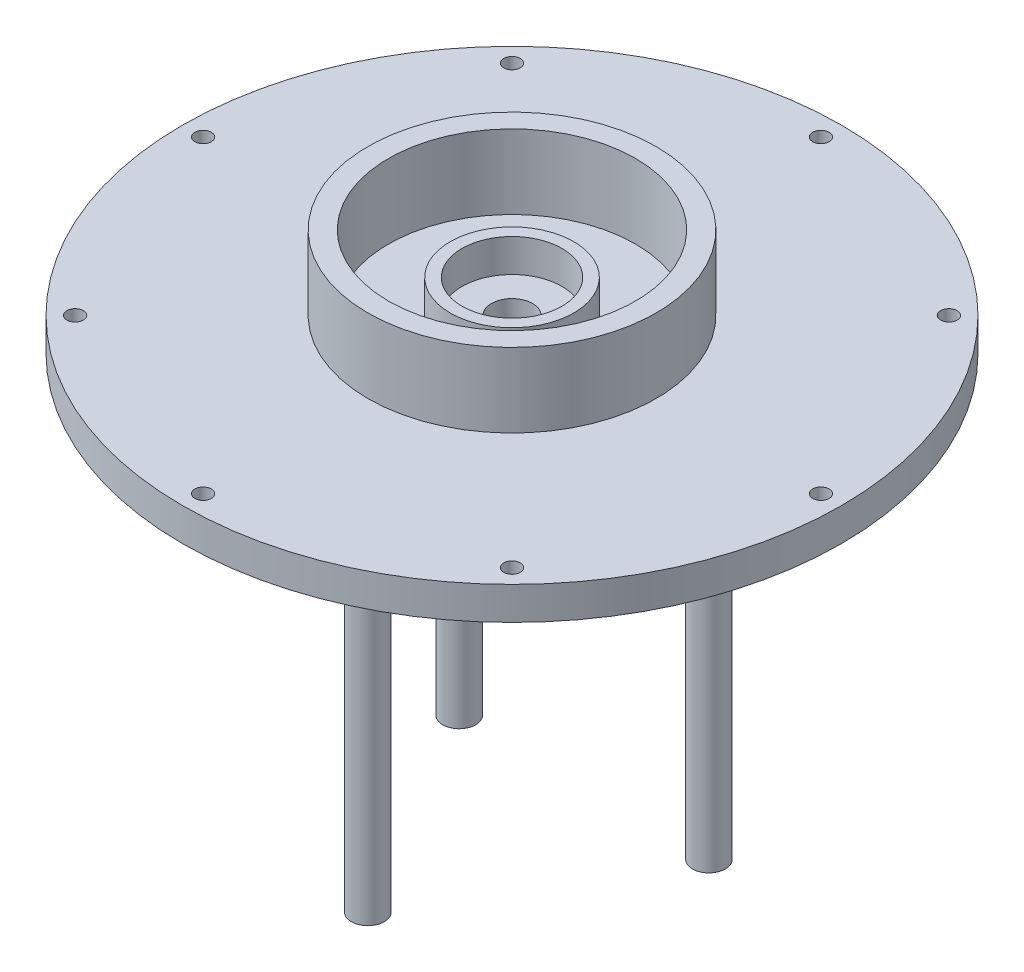
ISO-10303-21;
HEADER;
FILE_DESCRIPTION(('STEP AP214'),'2;1');
FILE_NAME('part.step','',(''),(''),'','','');
FILE_SCHEMA(('AUTOMOTIVE_DESIGN { 1 0 10303 214 1 1 1 1 }'));
ENDSEC;
DATA;
#1=APPLICATION_CONTEXT('core data for automotive mechanical design processes');
#2=APPLICATION_PROTOCOL_DEFINITION('international standard','automotive_design',2000,#1);
#3=PRODUCT_CONTEXT('',#1,'mechanical');
#4=PRODUCT('Part','Part','',(#3));
#5=PRODUCT_RELATED_PRODUCT_CATEGORY('part','',(#4));
#6=PRODUCT_DEFINITION_FORMATION('','',#4);
#7=PRODUCT_DEFINITION_CONTEXT('part definition',#1,'design');
#8=PRODUCT_DEFINITION('design','',#6,#7);
#9=PRODUCT_DEFINITION_SHAPE('','',#8);
#10=(LENGTH_UNIT() NAMED_UNIT(*) SI_UNIT(.MILLI.,.METRE.));
#11=(NAMED_UNIT(*) PLANE_ANGLE_UNIT() SI_UNIT($,.RADIAN.));
#12=(NAMED_UNIT(*) SI_UNIT($,.STERADIAN.) SOLID_ANGLE_UNIT());
#13=UNCERTAINTY_MEASURE_WITH_UNIT(LENGTH_MEASURE(1.E-05),#10,'distance_accuracy_value','');
#14=(GEOMETRIC_REPRESENTATION_CONTEXT(3) GLOBAL_UNCERTAINTY_ASSIGNED_CONTEXT((#13)) GLOBAL_UNIT_ASSIGNED_CONTEXT((#10,
#11,#12)) REPRESENTATION_CONTEXT('',''));
#15=CARTESIAN_POINT('',(0.,0.,0.));
#16=DIRECTION('',(0.,0.,1.));
#17=DIRECTION('',(1.,0.,0.));
#18=AXIS2_PLACEMENT_3D('',#15,#16,#17);
#19=CARTESIAN_POINT('',(0.,8.,0.));
#20=DIRECTION('',(0.,1.,0.));
#21=DIRECTION('',(0.,0.,1.));
#22=AXIS2_PLACEMENT_3D('',#19,#20,#21);
#23=PLANE('',#22);
#24=CARTESIAN_POINT('',(0.,8.,0.));
#25=DIRECTION('',(0.,1.,0.));
#26=DIRECTION('',(0.,0.,1.));
#27=AXIS2_PLACEMENT_3D('',#24,#25,#26);
#28=CIRCLE('',#27,15.);
#29=CARTESIAN_POINT('',(0.,8.,15.));
#30=VERTEX_POINT('',#29);
#31=EDGE_CURVE('E176',#30,#30,#28,.T.);
#32=ORIENTED_EDGE('',*,*,#31,.F.);
#33=EDGE_LOOP('',(#32));
#34=FACE_BOUND('',#33,.T.);
#35=CARTESIAN_POINT('',(0.,8.,0.));
#36=DIRECTION('',(0.,1.,0.));
#37=DIRECTION('',(0.,0.,1.));
#38=AXIS2_PLACEMENT_3D('',#35,#36,#37);
#39=CIRCLE('',#38,30.);
#40=CARTESIAN_POINT('',(0.,8.,30.));
#41=VERTEX_POINT('',#40);
#42=EDGE_CURVE('E85',#41,#41,#39,.F.);
#43=ORIENTED_EDGE('',*,*,#42,.F.);
#44=EDGE_LOOP('',(#43));
#45=FACE_BOUND('',#44,.T.);
#46=ADVANCED_FACE('F67',(#34,#45),#23,.T.);
#47=CARTESIAN_POINT('',(0.,8.,0.));
#48=DIRECTION('',(0.,1.,0.));
#49=DIRECTION('',(0.,0.,1.));
#50=AXIS2_PLACEMENT_3D('',#47,#48,#49);
#51=CIRCLE('',#50,5.);
#52=CARTESIAN_POINT('',(0.,8.,5.));
#53=VERTEX_POINT('',#52);
#54=EDGE_CURVE('E134',#53,#53,#51,.T.);
#55=ORIENTED_EDGE('',*,*,#54,.F.);
#56=EDGE_LOOP('',(#55));
#57=FACE_BOUND('',#56,.T.);
#58=CARTESIAN_POINT('',(0.,8.,0.));
#59=DIRECTION('',(0.,1.,0.));
#60=DIRECTION('',(0.,0.,1.));
#61=AXIS2_PLACEMENT_3D('',#58,#59,#60);
#62=CIRCLE('',#61,12.15);
#63=CARTESIAN_POINT('',(0.,8.,12.15));
#64=VERTEX_POINT('',#63);
#65=EDGE_CURVE('E91',#64,#64,#62,.F.);
#66=ORIENTED_EDGE('',*,*,#65,.F.);
#67=EDGE_LOOP('',(#66));
#68=FACE_BOUND('',#67,.T.);
#69=ADVANCED_FACE('F228',(#57,#68),#23,.T.);
#70=CARTESIAN_POINT('',(0.,8.,0.));
#71=DIRECTION('',(0.,1.,0.));
#72=DIRECTION('',(0.,0.,1.));
#73=AXIS2_PLACEMENT_3D('',#70,#71,#72);
#74=CIRCLE('',#73,35.);
#75=CARTESIAN_POINT('',(0.,8.,35.));
#76=VERTEX_POINT('',#75);
#77=EDGE_CURVE('E181',#76,#76,#74,.T.);
#78=ORIENTED_EDGE('',*,*,#77,.F.);
#79=EDGE_LOOP('',(#78));
#80=FACE_BOUND('',#79,.T.);
#81=CARTESIAN_POINT('',(0.,8.,-75.));
#82=DIRECTION('',(0.,1.,0.));
#83=DIRECTION('',(0.,0.,1.));
#84=AXIS2_PLACEMENT_3D('',#81,#82,#83);
#85=CIRCLE('',#84,2.);
#86=CARTESIAN_POINT('',(0.,8.,-73.));
#87=VERTEX_POINT('',#86);
#88=EDGE_CURVE('E129',#87,#87,#85,.T.);
#89=ORIENTED_EDGE('',*,*,#88,.F.);
#90=EDGE_LOOP('',(#89));
#91=FACE_BOUND('',#90,.T.);
#92=CARTESIAN_POINT('',(53.0330085889912,8.,-53.033008588991));
#93=DIRECTION('',(0.,1.,0.));
#94=DIRECTION('',(0.,0.,1.));
#95=AXIS2_PLACEMENT_3D('',#92,#93,#94);
#96=CIRCLE('',#95,2.);
#97=CARTESIAN_POINT('',(53.0330085889912,8.,-51.033008588991));
#98=VERTEX_POINT('',#97);
#99=EDGE_CURVE('E169',#98,#98,#96,.T.);
#100=ORIENTED_EDGE('',*,*,#99,.F.);
#101=EDGE_LOOP('',(#100));
#102=FACE_BOUND('',#101,.T.);
#103=CARTESIAN_POINT('',(75.,8.,2.61861100413235E-13));
#104=DIRECTION('',(0.,1.,0.));
#105=DIRECTION('',(0.,0.,1.));
#106=AXIS2_PLACEMENT_3D('',#103,#104,#105);
#107=CIRCLE('',#106,2.);
#108=CARTESIAN_POINT('',(75.,8.,2.00000000000027));
#109=VERTEX_POINT('',#108);
#110=EDGE_CURVE('E165',#109,#109,#107,.T.);
#111=ORIENTED_EDGE('',*,*,#110,.F.);
#112=EDGE_LOOP('',(#111));
#113=FACE_BOUND('',#112,.T.);
#114=CARTESIAN_POINT('',(53.0330085889908,8.,53.0330085889914));
#115=DIRECTION('',(0.,1.,0.));
#116=DIRECTION('',(0.,0.,1.));
#117=AXIS2_PLACEMENT_3D('',#114,#115,#116);
#118=CIRCLE('',#117,2.);
#119=CARTESIAN_POINT('',(53.0330085889908,8.,55.0330085889914));
#120=VERTEX_POINT('',#119);
#121=EDGE_CURVE('E161',#120,#120,#118,.T.);
#122=ORIENTED_EDGE('',*,*,#121,.F.);
#123=EDGE_LOOP('',(#122));
#124=FACE_BOUND('',#123,.T.);
#125=CARTESIAN_POINT('',(-5.2372220082647E-13,8.,75.));
#126=DIRECTION('',(0.,1.,0.));
#127=DIRECTION('',(0.,0.,1.));
#128=AXIS2_PLACEMENT_3D('',#125,#126,#127);
#129=CIRCLE('',#128,2.);
#130=CARTESIAN_POINT('',(-5.2372220082647E-13,8.,77.));
#131=VERTEX_POINT('',#130);
#132=EDGE_CURVE('E157',#131,#131,#129,.T.);
#133=ORIENTED_EDGE('',*,*,#132,.F.);
#134=EDGE_LOOP('',(#133));
#135=FACE_BOUND('',#134,.T.);
#136=CARTESIAN_POINT('',(-53.0330085889915,8.,53.0330085889906));
#137=DIRECTION('',(0.,1.,0.));
#138=DIRECTION('',(0.,0.,1.));
#139=AXIS2_PLACEMENT_3D('',#136,#137,#138);
#140=CIRCLE('',#139,2.00000000000001);
#141=CARTESIAN_POINT('',(-53.0330085889915,8.,55.0330085889906));
#142=VERTEX_POINT('',#141);
#143=EDGE_CURVE('E153',#142,#142,#140,.T.);
#144=ORIENTED_EDGE('',*,*,#143,.F.);
#145=EDGE_LOOP('',(#144));
#146=FACE_BOUND('',#145,.T.);
#147=CARTESIAN_POINT('',(-75.,8.,-7.85583301239705E-13));
#148=DIRECTION('',(0.,1.,0.));
#149=DIRECTION('',(0.,0.,1.));
#150=AXIS2_PLACEMENT_3D('',#147,#148,#149);
#151=CIRCLE('',#150,2.);
#152=CARTESIAN_POINT('',(-75.,8.,1.99999999999922));
#153=VERTEX_POINT('',#152);
#154=EDGE_CURVE('E148',#153,#153,#151,.T.);
#155=ORIENTED_EDGE('',*,*,#154,.F.);
#156=EDGE_LOOP('',(#155));
#157=FACE_BOUND('',#156,.T.);
#158=CARTESIAN_POINT('',(-53.0330085889904,8.,-53.0330085889917));
#159=DIRECTION('',(0.,1.,0.));
#160=DIRECTION('',(0.,0.,1.));
#161=AXIS2_PLACEMENT_3D('',#158,#159,#160);
#162=CIRCLE('',#161,2.00000000000001);
#163=CARTESIAN_POINT('',(-53.0330085889904,8.,-51.0330085889917));
#164=VERTEX_POINT('',#163);
#165=EDGE_CURVE('E144',#164,#164,#162,.T.);
#166=ORIENTED_EDGE('',*,*,#165,.F.);
#167=EDGE_LOOP('',(#166));
#168=FACE_BOUND('',#167,.T.);
#169=CARTESIAN_POINT('',(0.,8.,0.));
#170=DIRECTION('',(0.,1.,0.));
#171=DIRECTION('',(0.,0.,1.));
#172=AXIS2_PLACEMENT_3D('',#169,#170,#171);
#173=CIRCLE('',#172,80.);
#174=CARTESIAN_POINT('',(0.,8.,80.));
#175=VERTEX_POINT('',#174);
#176=EDGE_CURVE('E95',#175,#175,#173,.T.);
#177=ORIENTED_EDGE('',*,*,#176,.T.);
#178=EDGE_LOOP('',(#177));
#179=FACE_BOUND('',#178,.T.);
#180=ADVANCED_FACE('F231',(#80,#91,#102,#113,#124,#135,#146,#157,#168,#179),#23,.T.);
#181=CARTESIAN_POINT('',(0.,0.,0.));
#182=DIRECTION('',(0.,1.,0.));
#183=DIRECTION('',(0.,0.,1.));
#184=AXIS2_PLACEMENT_3D('',#181,#182,#183);
#185=PLANE('',#184);
#186=CARTESIAN_POINT('',(-30.3108891324472,0.,-17.5000000000047));
#187=DIRECTION('',(0.,1.,0.));
#188=DIRECTION('',(0.,0.,1.));
#189=AXIS2_PLACEMENT_3D('',#186,#187,#188);
#190=CIRCLE('',#189,4.00000000000952);
#191=CARTESIAN_POINT('',(-30.3108891324472,0.,-13.4999999999952));
#192=VERTEX_POINT('',#191);
#193=EDGE_CURVE('E11',#192,#192,#190,.F.);
#194=ORIENTED_EDGE('',*,*,#193,.F.);
#195=EDGE_LOOP('',(#194));
#196=FACE_BOUND('',#195,.T.);
#197=CARTESIAN_POINT('',(30.3108891324636,0.,-17.4999999999953));
#198=DIRECTION('',(0.,1.,0.));
#199=DIRECTION('',(0.,0.,1.));
#200=AXIS2_PLACEMENT_3D('',#197,#198,#199);
#201=CIRCLE('',#200,4.00000000000663);
#202=CARTESIAN_POINT('',(30.3108891324636,0.,-13.4999999999886));
#203=VERTEX_POINT('',#202);
#204=EDGE_CURVE('E75',#203,#203,#201,.F.);
#205=ORIENTED_EDGE('',*,*,#204,.F.);
#206=EDGE_LOOP('',(#205));
#207=FACE_BOUND('',#206,.T.);
#208=CARTESIAN_POINT('',(0.,0.,35.));
#209=DIRECTION('',(0.,1.,0.));
#210=DIRECTION('',(0.,0.,1.));
#211=AXIS2_PLACEMENT_3D('',#208,#209,#210);
#212=CIRCLE('',#211,4.);
#213=CARTESIAN_POINT('',(0.,0.,39.));
#214=VERTEX_POINT('',#213);
#215=EDGE_CURVE('E80',#214,#214,#212,.F.);
#216=ORIENTED_EDGE('',*,*,#215,.F.);
#217=EDGE_LOOP('',(#216));
#218=FACE_BOUND('',#217,.T.);
#219=CARTESIAN_POINT('',(0.,0.,-75.));
#220=DIRECTION('',(0.,1.,0.));
#221=DIRECTION('',(0.,0.,1.));
#222=AXIS2_PLACEMENT_3D('',#219,#220,#221);
#223=CIRCLE('',#222,2.);
#224=CARTESIAN_POINT('',(0.,0.,-73.));
#225=VERTEX_POINT('',#224);
#226=EDGE_CURVE('E96',#225,#225,#223,.T.);
#227=ORIENTED_EDGE('',*,*,#226,.T.);
#228=EDGE_LOOP('',(#227));
#229=FACE_BOUND('',#228,.T.);
#230=CARTESIAN_POINT('',(53.0330085889912,0.,-53.033008588991));
#231=DIRECTION('',(0.,1.,0.));
#232=DIRECTION('',(0.,0.,1.));
#233=AXIS2_PLACEMENT_3D('',#230,#231,#232);
#234=CIRCLE('',#233,2.);
#235=CARTESIAN_POINT('',(53.0330085889912,0.,-51.033008588991));
#236=VERTEX_POINT('',#235);
#237=EDGE_CURVE('E101',#236,#236,#234,.T.);
#238=ORIENTED_EDGE('',*,*,#237,.T.);
#239=EDGE_LOOP('',(#238));
#240=FACE_BOUND('',#239,.T.);
#241=CARTESIAN_POINT('',(75.,0.,2.61861100413235E-13));
#242=DIRECTION('',(0.,1.,0.));
#243=DIRECTION('',(0.,0.,1.));
#244=AXIS2_PLACEMENT_3D('',#241,#242,#243);
#245=CIRCLE('',#244,2.);
#246=CARTESIAN_POINT('',(75.,0.,2.00000000000027));
#247=VERTEX_POINT('',#246);
#248=EDGE_CURVE('E105',#247,#247,#245,.T.);
#249=ORIENTED_EDGE('',*,*,#248,.T.);
#250=EDGE_LOOP('',(#249));
#251=FACE_BOUND('',#250,.T.);
#252=CARTESIAN_POINT('',(53.0330085889908,0.,53.0330085889914));
#253=DIRECTION('',(0.,1.,0.));
#254=DIRECTION('',(0.,0.,1.));
#255=AXIS2_PLACEMENT_3D('',#252,#253,#254);
#256=CIRCLE('',#255,2.);
#257=CARTESIAN_POINT('',(53.0330085889908,0.,55.0330085889914));
#258=VERTEX_POINT('',#257);
#259=EDGE_CURVE('E109',#258,#258,#256,.T.);
#260=ORIENTED_EDGE('',*,*,#259,.T.);
#261=EDGE_LOOP('',(#260));
#262=FACE_BOUND('',#261,.T.);
#263=CARTESIAN_POINT('',(-5.2372220082647E-13,0.,75.));
#264=DIRECTION('',(0.,1.,0.));
#265=DIRECTION('',(0.,0.,1.));
#266=AXIS2_PLACEMENT_3D('',#263,#264,#265);
#267=CIRCLE('',#266,2.);
#268=CARTESIAN_POINT('',(-5.2372220082647E-13,0.,77.));
#269=VERTEX_POINT('',#268);
#270=EDGE_CURVE('E113',#269,#269,#267,.T.);
#271=ORIENTED_EDGE('',*,*,#270,.T.);
#272=EDGE_LOOP('',(#271));
#273=FACE_BOUND('',#272,.T.);
#274=CARTESIAN_POINT('',(-53.0330085889915,0.,53.0330085889906));
#275=DIRECTION('',(0.,1.,0.));
#276=DIRECTION('',(0.,0.,1.));
#277=AXIS2_PLACEMENT_3D('',#274,#275,#276);
#278=CIRCLE('',#277,2.00000000000001);
#279=CARTESIAN_POINT('',(-53.0330085889915,0.,55.0330085889906));
#280=VERTEX_POINT('',#279);
#281=EDGE_CURVE('E117',#280,#280,#278,.T.);
#282=ORIENTED_EDGE('',*,*,#281,.T.);
#283=EDGE_LOOP('',(#282));
#284=FACE_BOUND('',#283,.T.);
#285=CARTESIAN_POINT('',(-75.,0.,-7.85583301239705E-13));
#286=DIRECTION('',(0.,1.,0.));
#287=DIRECTION('',(0.,0.,1.));
#288=AXIS2_PLACEMENT_3D('',#285,#286,#287);
#289=CIRCLE('',#288,2.);
#290=CARTESIAN_POINT('',(-75.,0.,1.99999999999922));
#291=VERTEX_POINT('',#290);
#292=EDGE_CURVE('E121',#291,#291,#289,.T.);
#293=ORIENTED_EDGE('',*,*,#292,.T.);
#294=EDGE_LOOP('',(#293));
#295=FACE_BOUND('',#294,.T.);
#296=CARTESIAN_POINT('',(-53.0330085889904,0.,-53.0330085889917));
#297=DIRECTION('',(0.,1.,0.));
#298=DIRECTION('',(0.,0.,1.));
#299=AXIS2_PLACEMENT_3D('',#296,#297,#298);
#300=CIRCLE('',#299,2.00000000000001);
#301=CARTESIAN_POINT('',(-53.0330085889904,0.,-51.0330085889917));
#302=VERTEX_POINT('',#301);
#303=EDGE_CURVE('E125',#302,#302,#300,.T.);
#304=ORIENTED_EDGE('',*,*,#303,.T.);
#305=EDGE_LOOP('',(#304));
#306=FACE_BOUND('',#305,.T.);
#307=CARTESIAN_POINT('',(0.,0.,0.));
#308=DIRECTION('',(0.,1.,0.));
#309=DIRECTION('',(0.,0.,1.));
#310=AXIS2_PLACEMENT_3D('',#307,#308,#309);
#311=CIRCLE('',#310,80.);
#312=CARTESIAN_POINT('',(0.,0.,80.));
#313=VERTEX_POINT('',#312);
#314=EDGE_CURVE('E130',#313,#313,#311,.T.);
#315=ORIENTED_EDGE('',*,*,#314,.F.);
#316=EDGE_LOOP('',(#315));
#317=FACE_BOUND('',#316,.T.);
#318=CARTESIAN_POINT('',(0.,0.,0.));
#319=DIRECTION('',(0.,1.,0.));
#320=DIRECTION('',(0.,0.,1.));
#321=AXIS2_PLACEMENT_3D('',#318,#319,#320);
#322=CIRCLE('',#321,5.);
#323=CARTESIAN_POINT('',(0.,0.,5.));
#324=VERTEX_POINT('',#323);
#325=EDGE_CURVE('E100',#324,#324,#322,.T.);
#326=ORIENTED_EDGE('',*,*,#325,.T.);
#327=EDGE_LOOP('',(#326));
#328=FACE_BOUND('',#327,.T.);
#329=ADVANCED_FACE('F241',(#196,#207,#218,#229,#240,#251,#262,#273,#284,#295,#306,#317,#328),
#185,.F.);
#330=CARTESIAN_POINT('',(0.,8.,0.));
#331=DIRECTION('',(0.,-1.,0.));
#332=DIRECTION('',(0.,0.,-1.));
#333=AXIS2_PLACEMENT_3D('',#330,#331,#332);
#334=CYLINDRICAL_SURFACE('',#333,80.);
#335=ORIENTED_EDGE('',*,*,#176,.F.);
#336=EDGE_LOOP('',(#335));
#337=FACE_BOUND('',#336,.T.);
#338=ORIENTED_EDGE('',*,*,#314,.T.);
#339=EDGE_LOOP('',(#338));
#340=FACE_BOUND('',#339,.T.);
#341=ADVANCED_FACE('F69',(#337,#340),#334,.T.);
#342=CARTESIAN_POINT('',(0.,8.,0.));
#343=DIRECTION('',(0.,-1.,0.));
#344=DIRECTION('',(0.,0.,-1.));
#345=AXIS2_PLACEMENT_3D('',#342,#343,#344);
#346=CYLINDRICAL_SURFACE('',#345,5.);
#347=ORIENTED_EDGE('',*,*,#54,.T.);
#348=EDGE_LOOP('',(#347));
#349=FACE_BOUND('',#348,.T.);
#350=ORIENTED_EDGE('',*,*,#325,.F.);
#351=EDGE_LOOP('',(#350));
#352=FACE_BOUND('',#351,.T.);
#353=ADVANCED_FACE('F270',(#349,#352),#346,.F.);
#354=CARTESIAN_POINT('',(-53.0330085889904,-2.,-53.0330085889917));
#355=DIRECTION('',(0.,1.,0.));
#356=DIRECTION('',(0.,0.,1.));
#357=AXIS2_PLACEMENT_3D('',#354,#355,#356);
#358=CYLINDRICAL_SURFACE('',#357,2.00000000000001);
#359=ORIENTED_EDGE('',*,*,#165,.T.);
#360=EDGE_LOOP('',(#359));
#361=FACE_BOUND('',#360,.T.);
#362=ORIENTED_EDGE('',*,*,#303,.F.);
#363=EDGE_LOOP('',(#362));
#364=FACE_BOUND('',#363,.T.);
#365=ADVANCED_FACE('F277',(#361,#364),#358,.F.);
#366=CARTESIAN_POINT('',(-75.,-2.,-7.85583301239705E-13));
#367=DIRECTION('',(0.,1.,0.));
#368=DIRECTION('',(0.,0.,1.));
#369=AXIS2_PLACEMENT_3D('',#366,#367,#368);
#370=CYLINDRICAL_SURFACE('',#369,2.);
#371=ORIENTED_EDGE('',*,*,#154,.T.);
#372=EDGE_LOOP('',(#371));
#373=FACE_BOUND('',#372,.T.);
#374=ORIENTED_EDGE('',*,*,#292,.F.);
#375=EDGE_LOOP('',(#374));
#376=FACE_BOUND('',#375,.T.);
#377=ADVANCED_FACE('F282',(#373,#376),#370,.F.);
#378=CARTESIAN_POINT('',(-53.0330085889915,-2.,53.0330085889906));
#379=DIRECTION('',(0.,1.,0.));
#380=DIRECTION('',(0.,0.,1.));
#381=AXIS2_PLACEMENT_3D('',#378,#379,#380);
#382=CYLINDRICAL_SURFACE('',#381,2.00000000000001);
#383=ORIENTED_EDGE('',*,*,#143,.T.);
#384=EDGE_LOOP('',(#383));
#385=FACE_BOUND('',#384,.T.);
#386=ORIENTED_EDGE('',*,*,#281,.F.);
#387=EDGE_LOOP('',(#386));
#388=FACE_BOUND('',#387,.T.);
#389=ADVANCED_FACE('F288',(#385,#388),#382,.F.);
#390=CARTESIAN_POINT('',(-5.2372220082647E-13,-2.,75.));
#391=DIRECTION('',(0.,1.,0.));
#392=DIRECTION('',(0.,0.,1.));
#393=AXIS2_PLACEMENT_3D('',#390,#391,#392);
#394=CYLINDRICAL_SURFACE('',#393,2.);
#395=ORIENTED_EDGE('',*,*,#132,.T.);
#396=EDGE_LOOP('',(#395));
#397=FACE_BOUND('',#396,.T.);
#398=ORIENTED_EDGE('',*,*,#270,.F.);
#399=EDGE_LOOP('',(#398));
#400=FACE_BOUND('',#399,.T.);
#401=ADVANCED_FACE('F292',(#397,#400),#394,.F.);
#402=CARTESIAN_POINT('',(53.0330085889908,-2.,53.0330085889914));
#403=DIRECTION('',(0.,1.,0.));
#404=DIRECTION('',(0.,0.,1.));
#405=AXIS2_PLACEMENT_3D('',#402,#403,#404);
#406=CYLINDRICAL_SURFACE('',#405,2.);
#407=ORIENTED_EDGE('',*,*,#121,.T.);
#408=EDGE_LOOP('',(#407));
#409=FACE_BOUND('',#408,.T.);
#410=ORIENTED_EDGE('',*,*,#259,.F.);
#411=EDGE_LOOP('',(#410));
#412=FACE_BOUND('',#411,.T.);
#413=ADVANCED_FACE('F296',(#409,#412),#406,.F.);
#414=CARTESIAN_POINT('',(75.,-2.,2.61861100413235E-13));
#415=DIRECTION('',(0.,1.,0.));
#416=DIRECTION('',(0.,0.,1.));
#417=AXIS2_PLACEMENT_3D('',#414,#415,#416);
#418=CYLINDRICAL_SURFACE('',#417,2.);
#419=ORIENTED_EDGE('',*,*,#110,.T.);
#420=EDGE_LOOP('',(#419));
#421=FACE_BOUND('',#420,.T.);
#422=ORIENTED_EDGE('',*,*,#248,.F.);
#423=EDGE_LOOP('',(#422));
#424=FACE_BOUND('',#423,.T.);
#425=ADVANCED_FACE('F300',(#421,#424),#418,.F.);
#426=CARTESIAN_POINT('',(53.0330085889912,-2.,-53.033008588991));
#427=DIRECTION('',(0.,1.,0.));
#428=DIRECTION('',(0.,0.,1.));
#429=AXIS2_PLACEMENT_3D('',#426,#427,#428);
#430=CYLINDRICAL_SURFACE('',#429,2.);
#431=ORIENTED_EDGE('',*,*,#99,.T.);
#432=EDGE_LOOP('',(#431));
#433=FACE_BOUND('',#432,.T.);
#434=ORIENTED_EDGE('',*,*,#237,.F.);
#435=EDGE_LOOP('',(#434));
#436=FACE_BOUND('',#435,.T.);
#437=ADVANCED_FACE('F304',(#433,#436),#430,.F.);
#438=CARTESIAN_POINT('',(0.,-2.,-75.));
#439=DIRECTION('',(0.,1.,0.));
#440=DIRECTION('',(0.,0.,1.));
#441=AXIS2_PLACEMENT_3D('',#438,#439,#440);
#442=CYLINDRICAL_SURFACE('',#441,2.);
#443=ORIENTED_EDGE('',*,*,#88,.T.);
#444=EDGE_LOOP('',(#443));
#445=FACE_BOUND('',#444,.T.);
#446=ORIENTED_EDGE('',*,*,#226,.F.);
#447=EDGE_LOOP('',(#446));
#448=FACE_BOUND('',#447,.T.);
#449=ADVANCED_FACE('F308',(#445,#448),#442,.F.);
#450=CARTESIAN_POINT('',(0.,16.,0.));
#451=DIRECTION('',(0.,-1.,0.));
#452=DIRECTION('',(0.,0.,-1.));
#453=AXIS2_PLACEMENT_3D('',#450,#451,#452);
#454=CYLINDRICAL_SURFACE('',#453,12.15);
#455=CARTESIAN_POINT('',(0.,16.,0.));
#456=DIRECTION('',(0.,1.,0.));
#457=DIRECTION('',(0.,0.,1.));
#458=AXIS2_PLACEMENT_3D('',#455,#456,#457);
#459=CIRCLE('',#458,12.15);
#460=CARTESIAN_POINT('',(0.,16.,12.15));
#461=VERTEX_POINT('',#460);
#462=EDGE_CURVE('E180',#461,#461,#459,.T.);
#463=ORIENTED_EDGE('',*,*,#462,.T.);
#464=EDGE_LOOP('',(#463));
#465=FACE_BOUND('',#464,.T.);
#466=ORIENTED_EDGE('',*,*,#65,.T.);
#467=EDGE_LOOP('',(#466));
#468=FACE_BOUND('',#467,.T.);
#469=ADVANCED_FACE('F311',(#465,#468),#454,.F.);
#470=CARTESIAN_POINT('',(0.,16.,0.));
#471=DIRECTION('',(0.,-1.,0.));
#472=DIRECTION('',(0.,0.,-1.));
#473=AXIS2_PLACEMENT_3D('',#470,#471,#472);
#474=CYLINDRICAL_SURFACE('',#473,15.);
#475=CARTESIAN_POINT('',(0.,16.,0.));
#476=DIRECTION('',(0.,1.,0.));
#477=DIRECTION('',(0.,0.,1.));
#478=AXIS2_PLACEMENT_3D('',#475,#476,#477);
#479=CIRCLE('',#478,15.);
#480=CARTESIAN_POINT('',(0.,16.,15.));
#481=VERTEX_POINT('',#480);
#482=EDGE_CURVE('E149',#481,#481,#479,.T.);
#483=ORIENTED_EDGE('',*,*,#482,.F.);
#484=EDGE_LOOP('',(#483));
#485=FACE_BOUND('',#484,.T.);
#486=ORIENTED_EDGE('',*,*,#31,.T.);
#487=EDGE_LOOP('',(#486));
#488=FACE_BOUND('',#487,.T.);
#489=ADVANCED_FACE('F314',(#485,#488),#474,.T.);
#490=CARTESIAN_POINT('',(0.,16.,0.));
#491=DIRECTION('',(0.,1.,0.));
#492=DIRECTION('',(0.,0.,1.));
#493=AXIS2_PLACEMENT_3D('',#490,#491,#492);
#494=PLANE('',#493);
#495=ORIENTED_EDGE('',*,*,#462,.F.);
#496=EDGE_LOOP('',(#495));
#497=FACE_BOUND('',#496,.T.);
#498=ORIENTED_EDGE('',*,*,#482,.T.);
#499=EDGE_LOOP('',(#498));
#500=FACE_BOUND('',#499,.T.);
#501=ADVANCED_FACE('F318',(#497,#500),#494,.T.);
#502=CARTESIAN_POINT('',(0.,16.,0.));
#503=DIRECTION('',(0.,-1.,0.));
#504=DIRECTION('',(0.,0.,-1.));
#505=AXIS2_PLACEMENT_3D('',#502,#503,#504);
#506=CYLINDRICAL_SURFACE('',#505,30.);
#507=ORIENTED_EDGE('',*,*,#42,.T.);
#508=EDGE_LOOP('',(#507));
#509=FACE_BOUND('',#508,.T.);
#510=CARTESIAN_POINT('',(0.,26.,0.));
#511=DIRECTION('',(0.,1.,0.));
#512=DIRECTION('',(0.,0.,1.));
#513=AXIS2_PLACEMENT_3D('',#510,#511,#512);
#514=CIRCLE('',#513,30.);
#515=CARTESIAN_POINT('',(0.,26.,30.));
#516=VERTEX_POINT('',#515);
#517=EDGE_CURVE('E195',#516,#516,#514,.T.);
#518=ORIENTED_EDGE('',*,*,#517,.T.);
#519=EDGE_LOOP('',(#518));
#520=FACE_BOUND('',#519,.T.);
#521=ADVANCED_FACE('F322',(#509,#520),#506,.F.);
#522=CARTESIAN_POINT('',(0.,16.,0.));
#523=DIRECTION('',(0.,-1.,0.));
#524=DIRECTION('',(0.,0.,-1.));
#525=AXIS2_PLACEMENT_3D('',#522,#523,#524);
#526=CYLINDRICAL_SURFACE('',#525,35.);
#527=ORIENTED_EDGE('',*,*,#77,.T.);
#528=EDGE_LOOP('',(#527));
#529=FACE_BOUND('',#528,.T.);
#530=CARTESIAN_POINT('',(0.,26.,0.));
#531=DIRECTION('',(0.,1.,0.));
#532=DIRECTION('',(0.,0.,1.));
#533=AXIS2_PLACEMENT_3D('',#530,#531,#532);
#534=CIRCLE('',#533,35.);
#535=CARTESIAN_POINT('',(0.,26.,35.));
#536=VERTEX_POINT('',#535);
#537=EDGE_CURVE('E191',#536,#536,#534,.T.);
#538=ORIENTED_EDGE('',*,*,#537,.F.);
#539=EDGE_LOOP('',(#538));
#540=FACE_BOUND('',#539,.T.);
#541=ADVANCED_FACE('F326',(#529,#540),#526,.T.);
#542=CARTESIAN_POINT('',(0.,26.,0.));
#543=DIRECTION('',(0.,1.,0.));
#544=DIRECTION('',(0.,0.,1.));
#545=AXIS2_PLACEMENT_3D('',#542,#543,#544);
#546=PLANE('',#545);
#547=ORIENTED_EDGE('',*,*,#537,.T.);
#548=EDGE_LOOP('',(#547));
#549=FACE_BOUND('',#548,.T.);
#550=ORIENTED_EDGE('',*,*,#517,.F.);
#551=EDGE_LOOP('',(#550));
#552=FACE_BOUND('',#551,.T.);
#553=ADVANCED_FACE('F330',(#549,#552),#546,.T.);
#554=CARTESIAN_POINT('',(0.,-100.,35.));
#555=DIRECTION('',(0.,1.,0.));
#556=DIRECTION('',(0.,0.,1.));
#557=AXIS2_PLACEMENT_3D('',#554,#555,#556);
#558=CYLINDRICAL_SURFACE('',#557,4.);
#559=ORIENTED_EDGE('',*,*,#215,.T.);
#560=EDGE_LOOP('',(#559));
#561=FACE_BOUND('',#560,.T.);
#562=CARTESIAN_POINT('',(0.,-100.,35.));
#563=DIRECTION('',(0.,-1.,0.));
#564=DIRECTION('',(0.,0.,-1.));
#565=AXIS2_PLACEMENT_3D('',#562,#563,#564);
#566=CIRCLE('',#565,4.);
#567=CARTESIAN_POINT('',(0.,-100.,31.));
#568=VERTEX_POINT('',#567);
#569=EDGE_CURVE('E200',#568,#568,#566,.T.);
#570=ORIENTED_EDGE('',*,*,#569,.F.);
#571=EDGE_LOOP('',(#570));
#572=FACE_BOUND('',#571,.T.);
#573=ADVANCED_FACE('F334',(#561,#572),#558,.T.);
#574=CARTESIAN_POINT('',(0.,-100.,0.));
#575=DIRECTION('',(0.,-1.,0.));
#576=DIRECTION('',(0.,0.,-1.));
#577=AXIS2_PLACEMENT_3D('',#574,#575,#576);
#578=PLANE('',#577);
#579=ORIENTED_EDGE('',*,*,#569,.T.);
#580=EDGE_LOOP('',(#579));
#581=FACE_BOUND('',#580,.T.);
#582=ADVANCED_FACE('F336',(#581),#578,.T.);
#583=CARTESIAN_POINT('',(30.3108891324636,-100.,-17.4999999999953));
#584=DIRECTION('',(0.,1.,0.));
#585=DIRECTION('',(0.,0.,1.));
#586=AXIS2_PLACEMENT_3D('',#583,#584,#585);
#587=CYLINDRICAL_SURFACE('',#586,4.00000000000663);
#588=CARTESIAN_POINT('',(30.3108891324636,-100.,-17.4999999999953));
#589=DIRECTION('',(0.,-1.,0.));
#590=DIRECTION('',(0.,0.,-1.));
#591=AXIS2_PLACEMENT_3D('',#588,#589,#590);
#592=CIRCLE('',#591,4.00000000000663);
#593=CARTESIAN_POINT('',(30.3108891324636,-100.,-21.5000000000019));
#594=VERTEX_POINT('',#593);
#595=EDGE_CURVE('E204',#594,#594,#592,.T.);
#596=ORIENTED_EDGE('',*,*,#595,.F.);
#597=EDGE_LOOP('',(#596));
#598=FACE_BOUND('',#597,.T.);
#599=ORIENTED_EDGE('',*,*,#204,.T.);
#600=EDGE_LOOP('',(#599));
#601=FACE_BOUND('',#600,.T.);
#602=ADVANCED_FACE('F223',(#598,#601),#587,.T.);
#603=CARTESIAN_POINT('',(0.,-100.,0.));
#604=DIRECTION('',(0.,-1.,0.));
#605=DIRECTION('',(0.,0.,-1.));
#606=AXIS2_PLACEMENT_3D('',#603,#604,#605);
#607=PLANE('',#606);
#608=ORIENTED_EDGE('',*,*,#595,.T.);
#609=EDGE_LOOP('',(#608));
#610=FACE_BOUND('',#609,.T.);
#611=ADVANCED_FACE('F216',(#610),#607,.T.);
#612=CARTESIAN_POINT('',(-30.3108891324472,-100.,-17.5000000000047));
#613=DIRECTION('',(0.,1.,0.));
#614=DIRECTION('',(0.,0.,1.));
#615=AXIS2_PLACEMENT_3D('',#612,#613,#614);
#616=CYLINDRICAL_SURFACE('',#615,4.00000000000952);
#617=ORIENTED_EDGE('',*,*,#193,.T.);
#618=EDGE_LOOP('',(#617));
#619=FACE_BOUND('',#618,.T.);
#620=CARTESIAN_POINT('',(-30.3108891324472,-100.,-17.5000000000047));
#621=DIRECTION('',(0.,-1.,0.));
#622=DIRECTION('',(0.,0.,-1.));
#623=AXIS2_PLACEMENT_3D('',#620,#621,#622);
#624=CIRCLE('',#623,4.00000000000952);
#625=CARTESIAN_POINT('',(-30.3108891324472,-100.,-21.5000000000143));
#626=VERTEX_POINT('',#625);
#627=EDGE_CURVE('E199',#626,#626,#624,.T.);
#628=ORIENTED_EDGE('',*,*,#627,.F.);
#629=EDGE_LOOP('',(#628));
#630=FACE_BOUND('',#629,.T.);
#631=ADVANCED_FACE('F214',(#619,#630),#616,.T.);
#632=CARTESIAN_POINT('',(0.,-100.,0.));
#633=DIRECTION('',(0.,-1.,0.));
#634=DIRECTION('',(0.,0.,-1.));
#635=AXIS2_PLACEMENT_3D('',#632,#633,#634);
#636=PLANE('',#635);
#637=ORIENTED_EDGE('',*,*,#627,.T.);
#638=EDGE_LOOP('',(#637));
#639=FACE_BOUND('',#638,.T.);
#640=ADVANCED_FACE('F212',(#639),#636,.T.);
#641=CLOSED_SHELL('',(#46,#69,#180,#329,#341,#353,#365,#377,#389,#401,#413,#425,#437,#449,#469,
#489,#501,#521,#541,#553,#573,#582,#602,#611,#631,#640));
#642=MANIFOLD_SOLID_BREP('B2',#641);
#643=ADVANCED_BREP_SHAPE_REPRESENTATION('',(#18,#642),#14);
#644=SHAPE_DEFINITION_REPRESENTATION(#9,#643);
ENDSEC;
END-ISO-10303-21;
